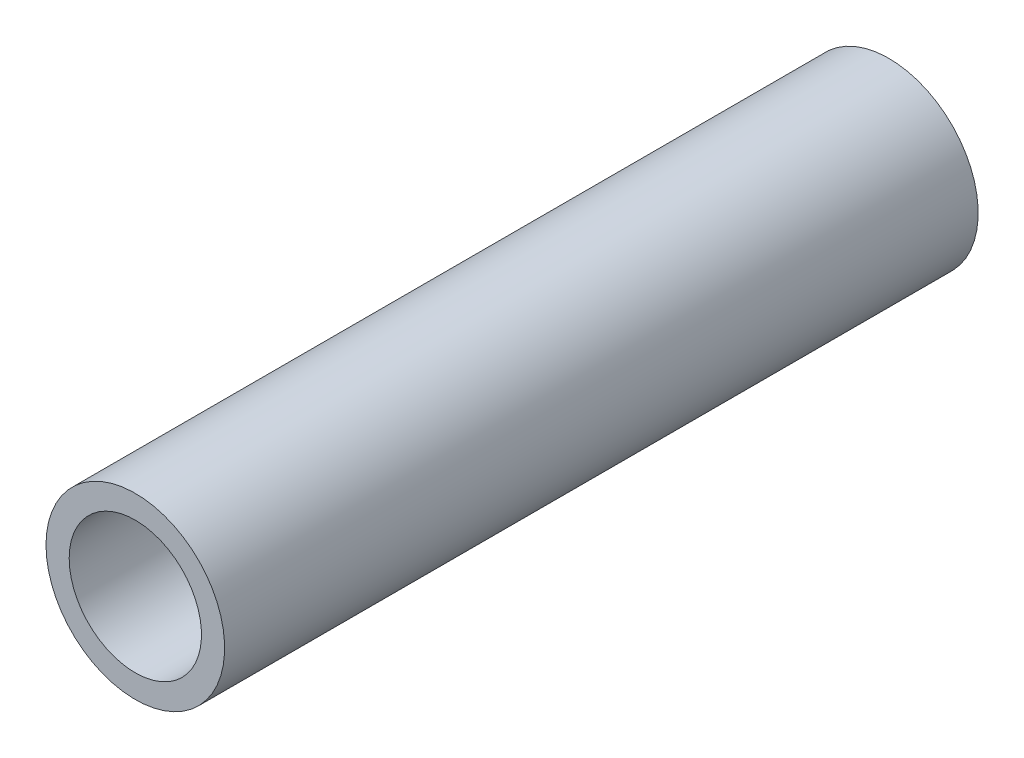
ISO-10303-21;
HEADER;
FILE_DESCRIPTION(('STEP AP214'),'2;1');
FILE_NAME('part.step','',(''),(''),'','','');
FILE_SCHEMA(('AUTOMOTIVE_DESIGN { 1 0 10303 214 1 1 1 1 }'));
ENDSEC;
DATA;
#1=APPLICATION_CONTEXT('core data for automotive mechanical design processes');
#2=APPLICATION_PROTOCOL_DEFINITION('international standard','automotive_design',2000,#1);
#3=PRODUCT_CONTEXT('',#1,'mechanical');
#4=PRODUCT('Part','Part','',(#3));
#5=PRODUCT_RELATED_PRODUCT_CATEGORY('part','',(#4));
#6=PRODUCT_DEFINITION_FORMATION('','',#4);
#7=PRODUCT_DEFINITION_CONTEXT('part definition',#1,'design');
#8=PRODUCT_DEFINITION('design','',#6,#7);
#9=PRODUCT_DEFINITION_SHAPE('','',#8);
#10=(LENGTH_UNIT() NAMED_UNIT(*) SI_UNIT(.MILLI.,.METRE.));
#11=(NAMED_UNIT(*) PLANE_ANGLE_UNIT() SI_UNIT($,.RADIAN.));
#12=(NAMED_UNIT(*) SI_UNIT($,.STERADIAN.) SOLID_ANGLE_UNIT());
#13=UNCERTAINTY_MEASURE_WITH_UNIT(LENGTH_MEASURE(1.E-05),#10,'distance_accuracy_value','');
#14=(GEOMETRIC_REPRESENTATION_CONTEXT(3) GLOBAL_UNCERTAINTY_ASSIGNED_CONTEXT((#13)) GLOBAL_UNIT_ASSIGNED_CONTEXT((#10,
#11,#12)) REPRESENTATION_CONTEXT('',''));
#15=CARTESIAN_POINT('',(0.,0.,0.));
#16=DIRECTION('',(0.,0.,1.));
#17=DIRECTION('',(1.,0.,0.));
#18=AXIS2_PLACEMENT_3D('',#15,#16,#17);
#19=CARTESIAN_POINT('',(0.,0.,45.));
#20=DIRECTION('',(0.,0.,1.));
#21=DIRECTION('',(1.,0.,0.));
#22=AXIS2_PLACEMENT_3D('',#19,#20,#21);
#23=PLANE('',#22);
#24=CARTESIAN_POINT('',(0.,0.,45.));
#25=DIRECTION('',(0.,0.,1.));
#26=DIRECTION('',(1.,0.,0.));
#27=AXIS2_PLACEMENT_3D('',#24,#25,#26);
#28=CIRCLE('',#27,10.668);
#29=CARTESIAN_POINT('',(-10.668,0.,45.));
#30=VERTEX_POINT('',#29);
#31=EDGE_CURVE('E11',#30,#30,#28,.T.);
#32=ORIENTED_EDGE('',*,*,#31,.T.);
#33=EDGE_LOOP('',(#32));
#34=FACE_BOUND('',#33,.T.);
#35=CARTESIAN_POINT('',(0.,0.,45.));
#36=DIRECTION('',(0.,0.,1.));
#37=DIRECTION('',(1.,0.,0.));
#38=AXIS2_PLACEMENT_3D('',#35,#36,#37);
#39=CIRCLE('',#38,7.8994);
#40=CARTESIAN_POINT('',(-7.8994,0.,45.));
#41=VERTEX_POINT('',#40);
#42=EDGE_CURVE('E56',#41,#41,#39,.T.);
#43=ORIENTED_EDGE('',*,*,#42,.F.);
#44=EDGE_LOOP('',(#43));
#45=FACE_BOUND('',#44,.T.);
#46=ADVANCED_FACE('F43',(#34,#45),#23,.T.);
#47=CARTESIAN_POINT('',(0.,0.,-45.));
#48=DIRECTION('',(0.,0.,1.));
#49=DIRECTION('',(1.,0.,0.));
#50=AXIS2_PLACEMENT_3D('',#47,#48,#49);
#51=PLANE('',#50);
#52=CARTESIAN_POINT('',(0.,0.,-45.));
#53=DIRECTION('',(0.,0.,1.));
#54=DIRECTION('',(1.,0.,0.));
#55=AXIS2_PLACEMENT_3D('',#52,#53,#54);
#56=CIRCLE('',#55,10.668);
#57=CARTESIAN_POINT('',(-10.668,0.,-45.));
#58=VERTEX_POINT('',#57);
#59=EDGE_CURVE('E47',#58,#58,#56,.T.);
#60=ORIENTED_EDGE('',*,*,#59,.F.);
#61=EDGE_LOOP('',(#60));
#62=FACE_BOUND('',#61,.T.);
#63=CARTESIAN_POINT('',(0.,0.,-45.));
#64=DIRECTION('',(0.,0.,1.));
#65=DIRECTION('',(1.,0.,0.));
#66=AXIS2_PLACEMENT_3D('',#63,#64,#65);
#67=CIRCLE('',#66,7.8994);
#68=CARTESIAN_POINT('',(-7.8994,0.,-45.));
#69=VERTEX_POINT('',#68);
#70=EDGE_CURVE('E58',#69,#69,#67,.T.);
#71=ORIENTED_EDGE('',*,*,#70,.T.);
#72=EDGE_LOOP('',(#71));
#73=FACE_BOUND('',#72,.T.);
#74=ADVANCED_FACE('F70',(#62,#73),#51,.F.);
#75=CARTESIAN_POINT('',(0.,0.,45.));
#76=DIRECTION('',(0.,0.,-1.));
#77=DIRECTION('',(-1.,0.,0.));
#78=AXIS2_PLACEMENT_3D('',#75,#76,#77);
#79=CYLINDRICAL_SURFACE('',#78,10.668);
#80=CARTESIAN_POINT('',(-10.668,0.,45.));
#81=CARTESIAN_POINT('',(-10.668,0.,44.0625));
#82=CARTESIAN_POINT('',(-10.668,0.,43.125));
#83=CARTESIAN_POINT('',(-10.668,0.,41.25));
#84=CARTESIAN_POINT('',(-10.668,0.,40.3125));
#85=CARTESIAN_POINT('',(-10.668,0.,38.4375));
#86=CARTESIAN_POINT('',(-10.668,0.,37.5));
#87=CARTESIAN_POINT('',(-10.668,0.,35.625));
#88=CARTESIAN_POINT('',(-10.668,0.,34.6875));
#89=CARTESIAN_POINT('',(-10.668,0.,32.8125));
#90=CARTESIAN_POINT('',(-10.668,0.,31.875));
#91=CARTESIAN_POINT('',(-10.668,0.,30.));
#92=CARTESIAN_POINT('',(-10.668,0.,29.0625));
#93=CARTESIAN_POINT('',(-10.668,0.,27.1875));
#94=CARTESIAN_POINT('',(-10.668,0.,26.25));
#95=CARTESIAN_POINT('',(-10.668,0.,24.375));
#96=CARTESIAN_POINT('',(-10.668,0.,23.4375));
#97=CARTESIAN_POINT('',(-10.668,0.,21.5625));
#98=CARTESIAN_POINT('',(-10.668,0.,20.625));
#99=CARTESIAN_POINT('',(-10.668,0.,18.75));
#100=CARTESIAN_POINT('',(-10.668,0.,17.8125));
#101=CARTESIAN_POINT('',(-10.668,0.,15.9375));
#102=CARTESIAN_POINT('',(-10.668,0.,15.));
#103=CARTESIAN_POINT('',(-10.668,0.,13.125));
#104=CARTESIAN_POINT('',(-10.668,0.,12.1875));
#105=CARTESIAN_POINT('',(-10.668,0.,10.3125));
#106=CARTESIAN_POINT('',(-10.668,0.,9.37499999999999));
#107=CARTESIAN_POINT('',(-10.668,0.,7.49999999999999));
#108=CARTESIAN_POINT('',(-10.668,0.,6.56249999999999));
#109=CARTESIAN_POINT('',(-10.668,0.,4.68749999999999));
#110=CARTESIAN_POINT('',(-10.668,0.,3.74999999999999));
#111=CARTESIAN_POINT('',(-10.668,0.,1.87499999999999));
#112=CARTESIAN_POINT('',(-10.668,0.,0.937499999999987));
#113=CARTESIAN_POINT('',(-10.668,0.,-0.937500000000015));
#114=CARTESIAN_POINT('',(-10.668,0.,-1.87500000000002));
#115=CARTESIAN_POINT('',(-10.668,0.,-3.75000000000002));
#116=CARTESIAN_POINT('',(-10.668,0.,-4.68750000000002));
#117=CARTESIAN_POINT('',(-10.668,0.,-6.56250000000002));
#118=CARTESIAN_POINT('',(-10.668,0.,-7.50000000000002));
#119=CARTESIAN_POINT('',(-10.668,0.,-9.37500000000002));
#120=CARTESIAN_POINT('',(-10.668,0.,-10.3125));
#121=CARTESIAN_POINT('',(-10.668,0.,-12.1875));
#122=CARTESIAN_POINT('',(-10.668,0.,-13.125));
#123=CARTESIAN_POINT('',(-10.668,0.,-15.));
#124=CARTESIAN_POINT('',(-10.668,0.,-15.9375));
#125=CARTESIAN_POINT('',(-10.668,0.,-17.8125));
#126=CARTESIAN_POINT('',(-10.668,0.,-18.75));
#127=CARTESIAN_POINT('',(-10.668,0.,-20.625));
#128=CARTESIAN_POINT('',(-10.668,0.,-21.5625));
#129=CARTESIAN_POINT('',(-10.668,0.,-23.4375));
#130=CARTESIAN_POINT('',(-10.668,0.,-24.375));
#131=CARTESIAN_POINT('',(-10.668,0.,-26.25));
#132=CARTESIAN_POINT('',(-10.668,0.,-27.1875));
#133=CARTESIAN_POINT('',(-10.668,0.,-29.0625));
#134=CARTESIAN_POINT('',(-10.668,0.,-30.));
#135=CARTESIAN_POINT('',(-10.668,0.,-31.875));
#136=CARTESIAN_POINT('',(-10.668,0.,-32.8125));
#137=CARTESIAN_POINT('',(-10.668,0.,-34.6875));
#138=CARTESIAN_POINT('',(-10.668,0.,-35.625));
#139=CARTESIAN_POINT('',(-10.668,0.,-37.5));
#140=CARTESIAN_POINT('',(-10.668,0.,-38.4375));
#141=CARTESIAN_POINT('',(-10.668,0.,-40.3125));
#142=CARTESIAN_POINT('',(-10.668,0.,-41.25));
#143=CARTESIAN_POINT('',(-10.668,0.,-43.125));
#144=CARTESIAN_POINT('',(-10.668,0.,-44.0625));
#145=CARTESIAN_POINT('',(-10.668,0.,-45.));
#146=B_SPLINE_CURVE_WITH_KNOTS('',3,(#80,#81,#82,#83,#84,#85,#86,#87,#88,#89,#90,#91,#92,#93,
#94,#95,#96,#97,#98,#99,#100,#101,#102,#103,#104,#105,#106,#107,#108,#109,#110,#111,#112,#113,
#114,#115,#116,#117,#118,#119,#120,#121,#122,#123,#124,#125,#126,#127,#128,#129,#130,#131,#132,
#133,#134,#135,#136,#137,#138,#139,#140,#141,#142,#143,#144,#145),.UNSPECIFIED.,.F.,.F.,(4,2,2,
2,2,2,2,2,2,2,2,2,2,2,2,2,2,2,2,2,2,2,2,2,2,2,2,2,2,2,2,2,4),(0.,2.8125,5.625,8.43749999999999,
11.25,14.0625,16.875,19.6875,22.5,25.3125,28.125,30.9375,33.75,36.5625,39.375,42.1875,45.,
47.8125,50.625,53.4375,56.25,59.0625,61.875,64.6875,67.5,70.3125,73.125,75.9375,78.75,81.5625,
84.375,87.1875,90.),.UNSPECIFIED.);
#147=EDGE_CURVE('BSEAM45',#30,#58,#146,.T.);
#148=ORIENTED_EDGE('',*,*,#31,.F.);
#149=ORIENTED_EDGE('',*,*,#59,.T.);
#150=ORIENTED_EDGE('',*,*,#147,.T.);
#151=ORIENTED_EDGE('',*,*,#147,.F.);
#152=EDGE_LOOP('',(#148,#150,#149,#151));
#153=FACE_BOUND('',#152,.T.);
#154=ADVANCED_FACE('F45',(#153),#79,.T.);
#155=CARTESIAN_POINT('',(0.,0.,45.));
#156=DIRECTION('',(0.,0.,-1.));
#157=DIRECTION('',(-1.,0.,0.));
#158=AXIS2_PLACEMENT_3D('',#155,#156,#157);
#159=CYLINDRICAL_SURFACE('',#158,7.8994);
#160=CARTESIAN_POINT('',(-7.8994,0.,45.));
#161=CARTESIAN_POINT('',(-7.8994,0.,44.0625));
#162=CARTESIAN_POINT('',(-7.8994,0.,43.125));
#163=CARTESIAN_POINT('',(-7.8994,0.,41.25));
#164=CARTESIAN_POINT('',(-7.8994,0.,40.3125));
#165=CARTESIAN_POINT('',(-7.8994,0.,38.4375));
#166=CARTESIAN_POINT('',(-7.8994,0.,37.5));
#167=CARTESIAN_POINT('',(-7.8994,0.,35.625));
#168=CARTESIAN_POINT('',(-7.8994,0.,34.6875));
#169=CARTESIAN_POINT('',(-7.8994,0.,32.8125));
#170=CARTESIAN_POINT('',(-7.8994,0.,31.875));
#171=CARTESIAN_POINT('',(-7.8994,0.,30.));
#172=CARTESIAN_POINT('',(-7.8994,0.,29.0625));
#173=CARTESIAN_POINT('',(-7.8994,0.,27.1875));
#174=CARTESIAN_POINT('',(-7.8994,0.,26.25));
#175=CARTESIAN_POINT('',(-7.8994,0.,24.375));
#176=CARTESIAN_POINT('',(-7.8994,0.,23.4375));
#177=CARTESIAN_POINT('',(-7.8994,0.,21.5625));
#178=CARTESIAN_POINT('',(-7.8994,0.,20.625));
#179=CARTESIAN_POINT('',(-7.8994,0.,18.75));
#180=CARTESIAN_POINT('',(-7.8994,0.,17.8125));
#181=CARTESIAN_POINT('',(-7.8994,0.,15.9375));
#182=CARTESIAN_POINT('',(-7.8994,0.,15.));
#183=CARTESIAN_POINT('',(-7.8994,0.,13.125));
#184=CARTESIAN_POINT('',(-7.8994,0.,12.1875));
#185=CARTESIAN_POINT('',(-7.8994,0.,10.3125));
#186=CARTESIAN_POINT('',(-7.8994,0.,9.37499999999999));
#187=CARTESIAN_POINT('',(-7.8994,0.,7.49999999999999));
#188=CARTESIAN_POINT('',(-7.8994,0.,6.56249999999999));
#189=CARTESIAN_POINT('',(-7.8994,0.,4.68749999999999));
#190=CARTESIAN_POINT('',(-7.8994,0.,3.74999999999999));
#191=CARTESIAN_POINT('',(-7.8994,0.,1.87499999999999));
#192=CARTESIAN_POINT('',(-7.8994,0.,0.937499999999987));
#193=CARTESIAN_POINT('',(-7.8994,0.,-0.937500000000015));
#194=CARTESIAN_POINT('',(-7.8994,0.,-1.87500000000002));
#195=CARTESIAN_POINT('',(-7.8994,0.,-3.75000000000002));
#196=CARTESIAN_POINT('',(-7.8994,0.,-4.68750000000002));
#197=CARTESIAN_POINT('',(-7.8994,0.,-6.56250000000002));
#198=CARTESIAN_POINT('',(-7.8994,0.,-7.50000000000002));
#199=CARTESIAN_POINT('',(-7.8994,0.,-9.37500000000002));
#200=CARTESIAN_POINT('',(-7.8994,0.,-10.3125));
#201=CARTESIAN_POINT('',(-7.8994,0.,-12.1875));
#202=CARTESIAN_POINT('',(-7.8994,0.,-13.125));
#203=CARTESIAN_POINT('',(-7.8994,0.,-15.));
#204=CARTESIAN_POINT('',(-7.8994,0.,-15.9375));
#205=CARTESIAN_POINT('',(-7.8994,0.,-17.8125));
#206=CARTESIAN_POINT('',(-7.8994,0.,-18.75));
#207=CARTESIAN_POINT('',(-7.8994,0.,-20.625));
#208=CARTESIAN_POINT('',(-7.8994,0.,-21.5625));
#209=CARTESIAN_POINT('',(-7.8994,0.,-23.4375));
#210=CARTESIAN_POINT('',(-7.8994,0.,-24.375));
#211=CARTESIAN_POINT('',(-7.8994,0.,-26.25));
#212=CARTESIAN_POINT('',(-7.8994,0.,-27.1875));
#213=CARTESIAN_POINT('',(-7.8994,0.,-29.0625));
#214=CARTESIAN_POINT('',(-7.8994,0.,-30.));
#215=CARTESIAN_POINT('',(-7.8994,0.,-31.875));
#216=CARTESIAN_POINT('',(-7.8994,0.,-32.8125));
#217=CARTESIAN_POINT('',(-7.8994,0.,-34.6875));
#218=CARTESIAN_POINT('',(-7.8994,0.,-35.625));
#219=CARTESIAN_POINT('',(-7.8994,0.,-37.5));
#220=CARTESIAN_POINT('',(-7.8994,0.,-38.4375));
#221=CARTESIAN_POINT('',(-7.8994,0.,-40.3125));
#222=CARTESIAN_POINT('',(-7.8994,0.,-41.25));
#223=CARTESIAN_POINT('',(-7.8994,0.,-43.125));
#224=CARTESIAN_POINT('',(-7.8994,0.,-44.0625));
#225=CARTESIAN_POINT('',(-7.8994,0.,-45.));
#226=B_SPLINE_CURVE_WITH_KNOTS('',3,(#160,#161,#162,#163,#164,#165,#166,#167,#168,#169,#170,
#171,#172,#173,#174,#175,#176,#177,#178,#179,#180,#181,#182,#183,#184,#185,#186,#187,#188,#189,
#190,#191,#192,#193,#194,#195,#196,#197,#198,#199,#200,#201,#202,#203,#204,#205,#206,#207,#208,
#209,#210,#211,#212,#213,#214,#215,#216,#217,#218,#219,#220,#221,#222,#223,#224,#225),
.UNSPECIFIED.,.F.,.F.,(4,2,2,2,2,2,2,2,2,2,2,2,2,2,2,2,2,2,2,2,2,2,2,2,2,2,2,2,2,2,2,2,4),(0.,
2.8125,5.625,8.43749999999999,11.25,14.0625,16.875,19.6875,22.5,25.3125,28.125,30.9375,33.75,
36.5625,39.375,42.1875,45.,47.8125,50.625,53.4375,56.25,59.0625,61.875,64.6875,67.5,70.3125,
73.125,75.9375,78.75,81.5625,84.375,87.1875,90.),.UNSPECIFIED.);
#227=EDGE_CURVE('BSEAM66',#41,#69,#226,.T.);
#228=ORIENTED_EDGE('',*,*,#42,.T.);
#229=ORIENTED_EDGE('',*,*,#70,.F.);
#230=ORIENTED_EDGE('',*,*,#227,.T.);
#231=ORIENTED_EDGE('',*,*,#227,.F.);
#232=EDGE_LOOP('',(#228,#230,#229,#231));
#233=FACE_BOUND('',#232,.T.);
#234=ADVANCED_FACE('F66',(#233),#159,.F.);
#235=CLOSED_SHELL('',(#46,#74,#154,#234));
#236=MANIFOLD_SOLID_BREP('B2',#235);
#237=ADVANCED_BREP_SHAPE_REPRESENTATION('',(#18,#236),#14);
#238=SHAPE_DEFINITION_REPRESENTATION(#9,#237);
ENDSEC;
END-ISO-10303-21;
